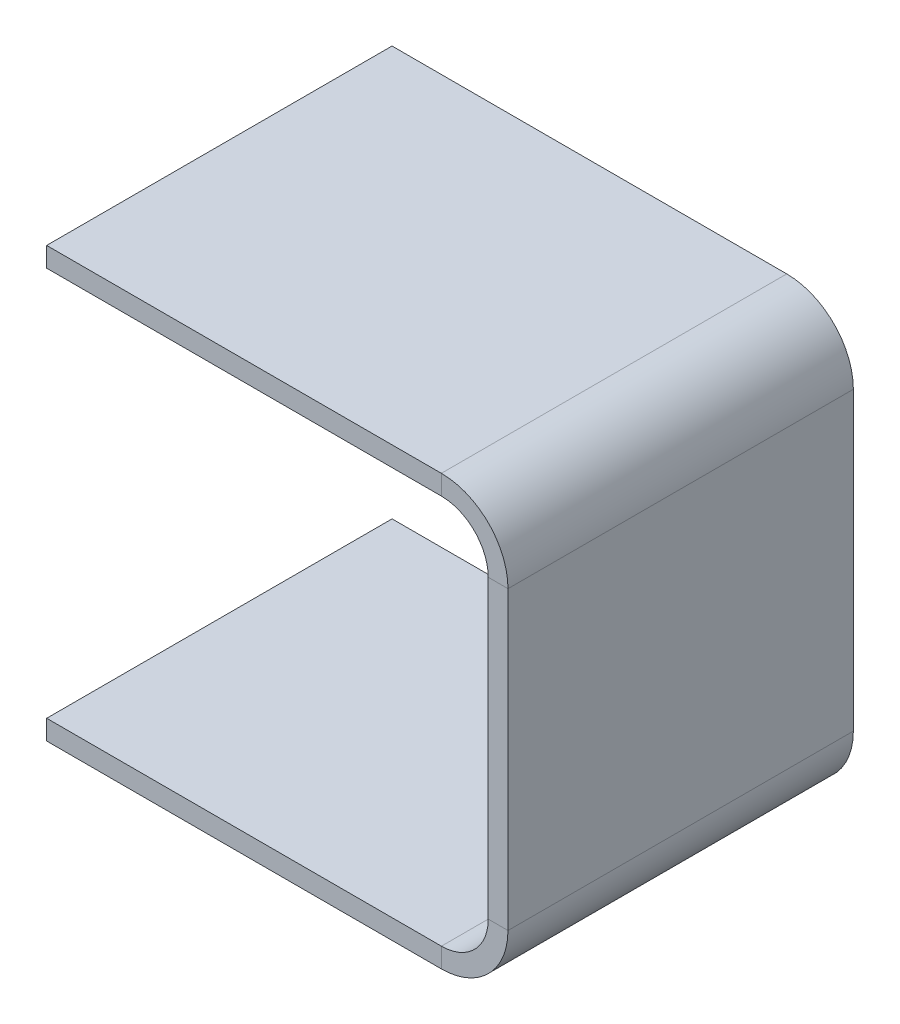
ISO-10303-21;
HEADER;
FILE_DESCRIPTION(('STEP AP214'),'2;1');
FILE_NAME('part.step','',(''),(''),'','','');
FILE_SCHEMA(('AUTOMOTIVE_DESIGN { 1 0 10303 214 1 1 1 1 }'));
ENDSEC;
DATA;
#1=APPLICATION_CONTEXT('core data for automotive mechanical design processes');
#2=APPLICATION_PROTOCOL_DEFINITION('international standard','automotive_design',2000,#1);
#3=PRODUCT_CONTEXT('',#1,'mechanical');
#4=PRODUCT('Part','Part','',(#3));
#5=PRODUCT_RELATED_PRODUCT_CATEGORY('part','',(#4));
#6=PRODUCT_DEFINITION_FORMATION('','',#4);
#7=PRODUCT_DEFINITION_CONTEXT('part definition',#1,'design');
#8=PRODUCT_DEFINITION('design','',#6,#7);
#9=PRODUCT_DEFINITION_SHAPE('','',#8);
#10=(LENGTH_UNIT() NAMED_UNIT(*) SI_UNIT(.MILLI.,.METRE.));
#11=(NAMED_UNIT(*) PLANE_ANGLE_UNIT() SI_UNIT($,.RADIAN.));
#12=(NAMED_UNIT(*) SI_UNIT($,.STERADIAN.) SOLID_ANGLE_UNIT());
#13=UNCERTAINTY_MEASURE_WITH_UNIT(LENGTH_MEASURE(1.E-05),#10,'distance_accuracy_value','');
#14=(GEOMETRIC_REPRESENTATION_CONTEXT(3) GLOBAL_UNCERTAINTY_ASSIGNED_CONTEXT((#13)) GLOBAL_UNIT_ASSIGNED_CONTEXT((#10,
#11,#12)) REPRESENTATION_CONTEXT('',''));
#15=CARTESIAN_POINT('',(0.,0.,0.));
#16=DIRECTION('',(0.,0.,1.));
#17=DIRECTION('',(1.,0.,0.));
#18=AXIS2_PLACEMENT_3D('',#15,#16,#17);
#19=CARTESIAN_POINT('',(39.9958939527827,36.7458939527828,0.));
#20=DIRECTION('',(0.,0.,-1.));
#21=DIRECTION('',(-1.,0.,0.));
#22=AXIS2_PLACEMENT_3D('',#19,#20,#21);
#23=PLANE('',#22);
#24=DIRECTION('',(1.,0.,0.));
#25=VECTOR('',#24,1.);
#26=CARTESIAN_POINT('',(46.7458939527828,36.7458939527828,0.));
#27=LINE('',#26,#25);
#28=CARTESIAN_POINT('',(44.7458939527828,36.7458939527828,0.));
#29=VERTEX_POINT('',#28);
#30=CARTESIAN_POINT('',(46.7458939527828,36.7458939527828,0.));
#31=VERTEX_POINT('',#30);
#32=EDGE_CURVE('E11',#29,#31,#27,.T.);
#33=ORIENTED_EDGE('',*,*,#32,.F.);
#34=CARTESIAN_POINT('',(39.9958939527827,36.7458939527828,0.));
#35=DIRECTION('',(0.,0.,-1.));
#36=DIRECTION('',(-1.,0.,0.));
#37=AXIS2_PLACEMENT_3D('',#34,#35,#36);
#38=CIRCLE('',#37,4.75000000000001);
#39=CARTESIAN_POINT('',(39.9958939527827,41.4958939527828,0.));
#40=VERTEX_POINT('',#39);
#41=EDGE_CURVE('E109',#29,#40,#38,.F.);
#42=ORIENTED_EDGE('',*,*,#41,.T.);
#43=DIRECTION('',(0.,1.,0.));
#44=VECTOR('',#43,1.);
#45=CARTESIAN_POINT('',(39.9958939527827,43.4958939527828,0.));
#46=LINE('',#45,#44);
#47=CARTESIAN_POINT('',(39.9958939527827,43.4958939527828,0.));
#48=VERTEX_POINT('',#47);
#49=EDGE_CURVE('E57',#40,#48,#46,.T.);
#50=ORIENTED_EDGE('',*,*,#49,.T.);
#51=CARTESIAN_POINT('',(39.9958939527827,36.7458939527828,0.));
#52=DIRECTION('',(0.,0.,1.));
#53=DIRECTION('',(1.,0.,0.));
#54=AXIS2_PLACEMENT_3D('',#51,#52,#53);
#55=CIRCLE('',#54,6.75000000000001);
#56=EDGE_CURVE('E112',#31,#48,#55,.T.);
#57=ORIENTED_EDGE('',*,*,#56,.F.);
#58=EDGE_LOOP('',(#33,#42,#50,#57));
#59=FACE_BOUND('',#58,.T.);
#60=ADVANCED_FACE('F46',(#59),#23,.T.);
#61=CARTESIAN_POINT('',(39.9958939527827,43.4958939527828,0.));
#62=DIRECTION('',(0.,0.,1.));
#63=DIRECTION('',(-1.,0.,0.));
#64=AXIS2_PLACEMENT_3D('',#61,#62,#63);
#65=PLANE('',#64);
#66=ORIENTED_EDGE('',*,*,#49,.F.);
#67=DIRECTION('',(1.,0.,0.));
#68=VECTOR('',#67,1.);
#69=CARTESIAN_POINT('',(39.9958939527827,41.4958939527828,0.));
#70=LINE('',#69,#68);
#71=CARTESIAN_POINT('',(-0.0041060472172616,41.4958939527828,0.));
#72=VERTEX_POINT('',#71);
#73=EDGE_CURVE('E302',#40,#72,#70,.F.);
#74=ORIENTED_EDGE('',*,*,#73,.T.);
#75=DIRECTION('',(0.,1.,0.));
#76=VECTOR('',#75,1.);
#77=CARTESIAN_POINT('',(-0.0041060472172616,43.4958939527828,0.));
#78=LINE('',#77,#76);
#79=CARTESIAN_POINT('',(-0.0041060472172616,43.4958939527828,0.));
#80=VERTEX_POINT('',#79);
#81=EDGE_CURVE('E184',#72,#80,#78,.T.);
#82=ORIENTED_EDGE('',*,*,#81,.T.);
#83=DIRECTION('',(-1.,0.,0.));
#84=VECTOR('',#83,1.);
#85=CARTESIAN_POINT('',(39.9958939527827,43.4958939527828,0.));
#86=LINE('',#85,#84);
#87=EDGE_CURVE('E210',#48,#80,#86,.T.);
#88=ORIENTED_EDGE('',*,*,#87,.F.);
#89=EDGE_LOOP('',(#66,#74,#82,#88));
#90=FACE_BOUND('',#89,.T.);
#91=ADVANCED_FACE('F211',(#90),#65,.F.);
#92=CARTESIAN_POINT('',(-0.0041060472172616,43.4958939527828,35.));
#93=DIRECTION('',(-1.,0.,0.));
#94=DIRECTION('',(0.,0.,-1.));
#95=AXIS2_PLACEMENT_3D('',#92,#93,#94);
#96=PLANE('',#95);
#97=ORIENTED_EDGE('',*,*,#81,.F.);
#98=DIRECTION('',(0.,0.,1.));
#99=VECTOR('',#98,1.);
#100=CARTESIAN_POINT('',(-0.0041060472172616,41.4958939527828,35.));
#101=LINE('',#100,#99);
#102=CARTESIAN_POINT('',(-0.0041060472172616,41.4958939527828,35.));
#103=VERTEX_POINT('',#102);
#104=EDGE_CURVE('E299',#103,#72,#101,.F.);
#105=ORIENTED_EDGE('',*,*,#104,.F.);
#106=DIRECTION('',(0.,1.,0.));
#107=VECTOR('',#106,1.);
#108=CARTESIAN_POINT('',(-0.0041060472172616,43.4958939527828,35.));
#109=LINE('',#108,#107);
#110=CARTESIAN_POINT('',(-0.0041060472172616,43.4958939527828,35.));
#111=VERTEX_POINT('',#110);
#112=EDGE_CURVE('E180',#103,#111,#109,.T.);
#113=ORIENTED_EDGE('',*,*,#112,.T.);
#114=DIRECTION('',(0.,0.,-1.));
#115=VECTOR('',#114,1.);
#116=CARTESIAN_POINT('',(-0.0041060472172616,43.4958939527828,35.));
#117=LINE('',#116,#115);
#118=EDGE_CURVE('E216',#111,#80,#117,.T.);
#119=ORIENTED_EDGE('',*,*,#118,.T.);
#120=EDGE_LOOP('',(#97,#105,#113,#119));
#121=FACE_BOUND('',#120,.T.);
#122=ADVANCED_FACE('F311',(#121),#96,.T.);
#123=CARTESIAN_POINT('',(39.9958939527827,43.4958939527828,35.));
#124=DIRECTION('',(0.,0.,1.));
#125=DIRECTION('',(-1.,0.,0.));
#126=AXIS2_PLACEMENT_3D('',#123,#124,#125);
#127=PLANE('',#126);
#128=ORIENTED_EDGE('',*,*,#112,.F.);
#129=DIRECTION('',(1.,0.,0.));
#130=VECTOR('',#129,1.);
#131=CARTESIAN_POINT('',(39.9958939527827,41.4958939527828,35.));
#132=LINE('',#131,#130);
#133=CARTESIAN_POINT('',(39.9958939527827,41.4958939527828,35.));
#134=VERTEX_POINT('',#133);
#135=EDGE_CURVE('E151',#134,#103,#132,.F.);
#136=ORIENTED_EDGE('',*,*,#135,.F.);
#137=DIRECTION('',(0.,1.,0.));
#138=VECTOR('',#137,1.);
#139=CARTESIAN_POINT('',(39.9958939527827,43.4958939527828,35.));
#140=LINE('',#139,#138);
#141=CARTESIAN_POINT('',(39.9958939527827,43.4958939527828,35.));
#142=VERTEX_POINT('',#141);
#143=EDGE_CURVE('E176',#134,#142,#140,.T.);
#144=ORIENTED_EDGE('',*,*,#143,.T.);
#145=DIRECTION('',(-1.,0.,0.));
#146=VECTOR('',#145,1.);
#147=CARTESIAN_POINT('',(39.9958939527827,43.4958939527828,35.));
#148=LINE('',#147,#146);
#149=EDGE_CURVE('E222',#142,#111,#148,.T.);
#150=ORIENTED_EDGE('',*,*,#149,.T.);
#151=EDGE_LOOP('',(#128,#136,#144,#150));
#152=FACE_BOUND('',#151,.T.);
#153=ADVANCED_FACE('F441',(#152),#127,.T.);
#154=CARTESIAN_POINT('',(39.9958939527827,36.7458939527828,35.));
#155=DIRECTION('',(0.,0.,-1.));
#156=DIRECTION('',(-1.,0.,0.));
#157=AXIS2_PLACEMENT_3D('',#154,#155,#156);
#158=PLANE('',#157);
#159=ORIENTED_EDGE('',*,*,#143,.F.);
#160=CARTESIAN_POINT('',(39.9958939527827,36.7458939527828,35.));
#161=DIRECTION('',(0.,0.,-1.));
#162=DIRECTION('',(-1.,0.,0.));
#163=AXIS2_PLACEMENT_3D('',#160,#161,#162);
#164=CIRCLE('',#163,4.75000000000001);
#165=CARTESIAN_POINT('',(44.7458939527828,36.7458939527828,35.));
#166=VERTEX_POINT('',#165);
#167=EDGE_CURVE('E140',#166,#134,#164,.F.);
#168=ORIENTED_EDGE('',*,*,#167,.F.);
#169=DIRECTION('',(1.,0.,0.));
#170=VECTOR('',#169,1.);
#171=CARTESIAN_POINT('',(46.7458939527828,36.7458939527828,35.));
#172=LINE('',#171,#170);
#173=CARTESIAN_POINT('',(46.7458939527828,36.7458939527828,35.));
#174=VERTEX_POINT('',#173);
#175=EDGE_CURVE('E172',#166,#174,#172,.T.);
#176=ORIENTED_EDGE('',*,*,#175,.T.);
#177=CARTESIAN_POINT('',(39.9958939527827,36.7458939527828,35.));
#178=DIRECTION('',(0.,0.,1.));
#179=DIRECTION('',(1.,0.,0.));
#180=AXIS2_PLACEMENT_3D('',#177,#178,#179);
#181=CIRCLE('',#180,6.75000000000001);
#182=EDGE_CURVE('E206',#174,#142,#181,.T.);
#183=ORIENTED_EDGE('',*,*,#182,.T.);
#184=EDGE_LOOP('',(#159,#168,#176,#183));
#185=FACE_BOUND('',#184,.T.);
#186=ADVANCED_FACE('F435',(#185),#158,.F.);
#187=CARTESIAN_POINT('',(46.7458939527828,6.74589395278275,35.));
#188=DIRECTION('',(0.,0.,1.));
#189=DIRECTION('',(0.,1.,0.));
#190=AXIS2_PLACEMENT_3D('',#187,#188,#189);
#191=PLANE('',#190);
#192=ORIENTED_EDGE('',*,*,#175,.F.);
#193=DIRECTION('',(0.,1.,0.));
#194=VECTOR('',#193,1.);
#195=CARTESIAN_POINT('',(44.7458939527828,6.74589395278275,35.));
#196=LINE('',#195,#194);
#197=CARTESIAN_POINT('',(44.7458939527828,6.74589395278275,35.));
#198=VERTEX_POINT('',#197);
#199=EDGE_CURVE('E128',#198,#166,#196,.T.);
#200=ORIENTED_EDGE('',*,*,#199,.F.);
#201=DIRECTION('',(1.,0.,0.));
#202=VECTOR('',#201,1.);
#203=CARTESIAN_POINT('',(46.7458939527828,6.74589395278275,35.));
#204=LINE('',#203,#202);
#205=CARTESIAN_POINT('',(46.7458939527828,6.74589395278275,35.));
#206=VERTEX_POINT('',#205);
#207=EDGE_CURVE('E168',#198,#206,#204,.T.);
#208=ORIENTED_EDGE('',*,*,#207,.T.);
#209=DIRECTION('',(0.,1.,0.));
#210=VECTOR('',#209,1.);
#211=CARTESIAN_POINT('',(46.7458939527828,6.74589395278275,35.));
#212=LINE('',#211,#210);
#213=EDGE_CURVE('E237',#206,#174,#212,.T.);
#214=ORIENTED_EDGE('',*,*,#213,.T.);
#215=EDGE_LOOP('',(#192,#200,#208,#214));
#216=FACE_BOUND('',#215,.T.);
#217=ADVANCED_FACE('F433',(#216),#191,.T.);
#218=CARTESIAN_POINT('',(40.,6.74589395278275,35.));
#219=DIRECTION('',(0.,0.,-1.));
#220=DIRECTION('',(-1.,0.,0.));
#221=AXIS2_PLACEMENT_3D('',#218,#219,#220);
#222=PLANE('',#221);
#223=ORIENTED_EDGE('',*,*,#207,.F.);
#224=CARTESIAN_POINT('',(40.,6.74589395278275,35.));
#225=DIRECTION('',(0.,0.,-1.));
#226=DIRECTION('',(-1.,0.,0.));
#227=AXIS2_PLACEMENT_3D('',#224,#225,#226);
#228=CIRCLE('',#227,4.74589395278275);
#229=CARTESIAN_POINT('',(40.,2.,35.));
#230=VERTEX_POINT('',#229);
#231=EDGE_CURVE('E217',#230,#198,#228,.F.);
#232=ORIENTED_EDGE('',*,*,#231,.F.);
#233=DIRECTION('',(0.,-1.,0.));
#234=VECTOR('',#233,1.);
#235=CARTESIAN_POINT('',(40.,0.,35.));
#236=LINE('',#235,#234);
#237=CARTESIAN_POINT('',(40.,0.,35.));
#238=VERTEX_POINT('',#237);
#239=EDGE_CURVE('E164',#230,#238,#236,.T.);
#240=ORIENTED_EDGE('',*,*,#239,.T.);
#241=CARTESIAN_POINT('',(40.,6.74589395278275,35.));
#242=DIRECTION('',(0.,0.,1.));
#243=DIRECTION('',(1.,0.,0.));
#244=AXIS2_PLACEMENT_3D('',#241,#242,#243);
#245=CIRCLE('',#244,6.74589395278275);
#246=EDGE_CURVE('E265',#238,#206,#245,.T.);
#247=ORIENTED_EDGE('',*,*,#246,.T.);
#248=EDGE_LOOP('',(#223,#232,#240,#247));
#249=FACE_BOUND('',#248,.T.);
#250=ADVANCED_FACE('F416',(#249),#222,.F.);
#251=CARTESIAN_POINT('',(0.,0.,35.));
#252=DIRECTION('',(0.,0.,1.));
#253=DIRECTION('',(1.,0.,0.));
#254=AXIS2_PLACEMENT_3D('',#251,#252,#253);
#255=PLANE('',#254);
#256=ORIENTED_EDGE('',*,*,#239,.F.);
#257=DIRECTION('',(1.,0.,0.));
#258=VECTOR('',#257,1.);
#259=CARTESIAN_POINT('',(0.,2.,35.));
#260=LINE('',#259,#258);
#261=CARTESIAN_POINT('',(0.,2.,35.));
#262=VERTEX_POINT('',#261);
#263=EDGE_CURVE('E274',#262,#230,#260,.T.);
#264=ORIENTED_EDGE('',*,*,#263,.F.);
#265=DIRECTION('',(0.,-1.,0.));
#266=VECTOR('',#265,1.);
#267=CARTESIAN_POINT('',(0.,0.,35.));
#268=LINE('',#267,#266);
#269=CARTESIAN_POINT('',(0.,0.,35.));
#270=VERTEX_POINT('',#269);
#271=EDGE_CURVE('E161',#262,#270,#268,.T.);
#272=ORIENTED_EDGE('',*,*,#271,.T.);
#273=DIRECTION('',(1.,0.,0.));
#274=VECTOR('',#273,1.);
#275=CARTESIAN_POINT('',(0.,0.,35.));
#276=LINE('',#275,#274);
#277=EDGE_CURVE('E254',#270,#238,#276,.T.);
#278=ORIENTED_EDGE('',*,*,#277,.T.);
#279=EDGE_LOOP('',(#256,#264,#272,#278));
#280=FACE_BOUND('',#279,.T.);
#281=ADVANCED_FACE('F488',(#280),#255,.T.);
#282=CARTESIAN_POINT('',(0.,0.,35.));
#283=DIRECTION('',(1.,0.,0.));
#284=DIRECTION('',(0.,0.,-1.));
#285=AXIS2_PLACEMENT_3D('',#282,#283,#284);
#286=PLANE('',#285);
#287=ORIENTED_EDGE('',*,*,#271,.F.);
#288=DIRECTION('',(0.,0.,1.));
#289=VECTOR('',#288,1.);
#290=CARTESIAN_POINT('',(0.,2.,35.));
#291=LINE('',#290,#289);
#292=CARTESIAN_POINT('',(0.,2.,0.));
#293=VERTEX_POINT('',#292);
#294=EDGE_CURVE('E280',#262,#293,#291,.F.);
#295=ORIENTED_EDGE('',*,*,#294,.T.);
#296=DIRECTION('',(0.,-1.,0.));
#297=VECTOR('',#296,1.);
#298=CARTESIAN_POINT('',(0.,0.,0.));
#299=LINE('',#298,#297);
#300=CARTESIAN_POINT('',(0.,0.,0.));
#301=VERTEX_POINT('',#300);
#302=EDGE_CURVE('E65',#293,#301,#299,.T.);
#303=ORIENTED_EDGE('',*,*,#302,.T.);
#304=DIRECTION('',(0.,0.,-1.));
#305=VECTOR('',#304,1.);
#306=CARTESIAN_POINT('',(0.,0.,35.));
#307=LINE('',#306,#305);
#308=EDGE_CURVE('E258',#270,#301,#307,.T.);
#309=ORIENTED_EDGE('',*,*,#308,.F.);
#310=EDGE_LOOP('',(#287,#295,#303,#309));
#311=FACE_BOUND('',#310,.T.);
#312=ADVANCED_FACE('F497',(#311),#286,.F.);
#313=CARTESIAN_POINT('',(0.,0.,0.));
#314=DIRECTION('',(0.,0.,1.));
#315=DIRECTION('',(1.,0.,0.));
#316=AXIS2_PLACEMENT_3D('',#313,#314,#315);
#317=PLANE('',#316);
#318=ORIENTED_EDGE('',*,*,#302,.F.);
#319=DIRECTION('',(1.,0.,0.));
#320=VECTOR('',#319,1.);
#321=CARTESIAN_POINT('',(0.,2.,0.));
#322=LINE('',#321,#320);
#323=CARTESIAN_POINT('',(40.,2.,0.));
#324=VERTEX_POINT('',#323);
#325=EDGE_CURVE('E275',#293,#324,#322,.T.);
#326=ORIENTED_EDGE('',*,*,#325,.T.);
#327=DIRECTION('',(0.,-1.,0.));
#328=VECTOR('',#327,1.);
#329=CARTESIAN_POINT('',(40.,0.,0.));
#330=LINE('',#329,#328);
#331=CARTESIAN_POINT('',(40.,0.,0.));
#332=VERTEX_POINT('',#331);
#333=EDGE_CURVE('E155',#324,#332,#330,.T.);
#334=ORIENTED_EDGE('',*,*,#333,.T.);
#335=DIRECTION('',(1.,0.,0.));
#336=VECTOR('',#335,1.);
#337=CARTESIAN_POINT('',(0.,0.,0.));
#338=LINE('',#337,#336);
#339=EDGE_CURVE('E246',#301,#332,#338,.T.);
#340=ORIENTED_EDGE('',*,*,#339,.F.);
#341=EDGE_LOOP('',(#318,#326,#334,#340));
#342=FACE_BOUND('',#341,.T.);
#343=ADVANCED_FACE('F424',(#342),#317,.F.);
#344=CARTESIAN_POINT('',(40.,6.74589395278275,0.));
#345=DIRECTION('',(0.,0.,-1.));
#346=DIRECTION('',(-1.,0.,0.));
#347=AXIS2_PLACEMENT_3D('',#344,#345,#346);
#348=PLANE('',#347);
#349=ORIENTED_EDGE('',*,*,#333,.F.);
#350=CARTESIAN_POINT('',(40.,6.74589395278275,0.));
#351=DIRECTION('',(0.,0.,-1.));
#352=DIRECTION('',(-1.,0.,0.));
#353=AXIS2_PLACEMENT_3D('',#350,#351,#352);
#354=CIRCLE('',#353,4.74589395278275);
#355=CARTESIAN_POINT('',(44.7458939527828,6.74589395278276,0.));
#356=VERTEX_POINT('',#355);
#357=EDGE_CURVE('E277',#324,#356,#354,.F.);
#358=ORIENTED_EDGE('',*,*,#357,.T.);
#359=DIRECTION('',(1.,0.,0.));
#360=VECTOR('',#359,1.);
#361=CARTESIAN_POINT('',(46.7458939527828,6.74589395278275,0.));
#362=LINE('',#361,#360);
#363=CARTESIAN_POINT('',(46.7458939527828,6.74589395278275,0.));
#364=VERTEX_POINT('',#363);
#365=EDGE_CURVE('E50',#356,#364,#362,.T.);
#366=ORIENTED_EDGE('',*,*,#365,.T.);
#367=CARTESIAN_POINT('',(40.,6.74589395278275,0.));
#368=DIRECTION('',(0.,0.,1.));
#369=DIRECTION('',(1.,0.,0.));
#370=AXIS2_PLACEMENT_3D('',#367,#368,#369);
#371=CIRCLE('',#370,6.74589395278275);
#372=EDGE_CURVE('E261',#332,#364,#371,.T.);
#373=ORIENTED_EDGE('',*,*,#372,.F.);
#374=EDGE_LOOP('',(#349,#358,#366,#373));
#375=FACE_BOUND('',#374,.T.);
#376=ADVANCED_FACE('F399',(#375),#348,.T.);
#377=CARTESIAN_POINT('',(46.7458939527828,6.74589395278275,0.));
#378=DIRECTION('',(0.,0.,1.));
#379=DIRECTION('',(0.,1.,0.));
#380=AXIS2_PLACEMENT_3D('',#377,#378,#379);
#381=PLANE('',#380);
#382=DIRECTION('',(0.,1.,0.));
#383=VECTOR('',#382,1.);
#384=CARTESIAN_POINT('',(44.7458939527828,6.74589395278275,0.));
#385=LINE('',#384,#383);
#386=EDGE_CURVE('E125',#356,#29,#385,.T.);
#387=ORIENTED_EDGE('',*,*,#386,.T.);
#388=ORIENTED_EDGE('',*,*,#32,.T.);
#389=DIRECTION('',(0.,1.,0.));
#390=VECTOR('',#389,1.);
#391=CARTESIAN_POINT('',(46.7458939527828,6.74589395278275,0.));
#392=LINE('',#391,#390);
#393=EDGE_CURVE('E225',#364,#31,#392,.T.);
#394=ORIENTED_EDGE('',*,*,#393,.F.);
#395=ORIENTED_EDGE('',*,*,#365,.F.);
#396=EDGE_LOOP('',(#387,#388,#394,#395));
#397=FACE_BOUND('',#396,.T.);
#398=ADVANCED_FACE('F48',(#397),#381,.F.);
#399=CARTESIAN_POINT('',(40.,6.74589395278275,35.));
#400=DIRECTION('',(0.,0.,-1.));
#401=DIRECTION('',(-1.,0.,0.));
#402=AXIS2_PLACEMENT_3D('',#399,#400,#401);
#403=CYLINDRICAL_SURFACE('',#402,6.74589395278275);
#404=ORIENTED_EDGE('',*,*,#372,.T.);
#405=DIRECTION('',(0.,0.,-1.));
#406=VECTOR('',#405,1.);
#407=CARTESIAN_POINT('',(46.7458939527828,6.74589395278275,35.));
#408=LINE('',#407,#406);
#409=EDGE_CURVE('E207',#206,#364,#408,.T.);
#410=ORIENTED_EDGE('',*,*,#409,.F.);
#411=ORIENTED_EDGE('',*,*,#246,.F.);
#412=DIRECTION('',(0.,0.,-1.));
#413=VECTOR('',#412,1.);
#414=CARTESIAN_POINT('',(40.,0.,35.));
#415=LINE('',#414,#413);
#416=EDGE_CURVE('E250',#238,#332,#415,.T.);
#417=ORIENTED_EDGE('',*,*,#416,.T.);
#418=EDGE_LOOP('',(#404,#410,#411,#417));
#419=FACE_BOUND('',#418,.T.);
#420=ADVANCED_FACE('F406',(#419),#403,.T.);
#421=CARTESIAN_POINT('',(0.,0.,35.));
#422=DIRECTION('',(0.,1.,0.));
#423=DIRECTION('',(0.,0.,1.));
#424=AXIS2_PLACEMENT_3D('',#421,#422,#423);
#425=PLANE('',#424);
#426=ORIENTED_EDGE('',*,*,#339,.T.);
#427=ORIENTED_EDGE('',*,*,#416,.F.);
#428=ORIENTED_EDGE('',*,*,#277,.F.);
#429=ORIENTED_EDGE('',*,*,#308,.T.);
#430=EDGE_LOOP('',(#426,#427,#428,#429));
#431=FACE_BOUND('',#430,.T.);
#432=ADVANCED_FACE('F420',(#431),#425,.F.);
#433=CARTESIAN_POINT('',(39.9958939527827,36.7458939527828,35.));
#434=DIRECTION('',(0.,0.,-1.));
#435=DIRECTION('',(-1.,0.,0.));
#436=AXIS2_PLACEMENT_3D('',#433,#434,#435);
#437=CYLINDRICAL_SURFACE('',#436,6.75000000000001);
#438=ORIENTED_EDGE('',*,*,#56,.T.);
#439=DIRECTION('',(0.,0.,-1.));
#440=VECTOR('',#439,1.);
#441=CARTESIAN_POINT('',(39.9958939527827,43.4958939527828,35.));
#442=LINE('',#441,#440);
#443=EDGE_CURVE('E202',#142,#48,#442,.T.);
#444=ORIENTED_EDGE('',*,*,#443,.F.);
#445=ORIENTED_EDGE('',*,*,#182,.F.);
#446=DIRECTION('',(0.,0.,-1.));
#447=VECTOR('',#446,1.);
#448=CARTESIAN_POINT('',(46.7458939527828,36.7458939527828,35.));
#449=LINE('',#448,#447);
#450=EDGE_CURVE('E204',#174,#31,#449,.T.);
#451=ORIENTED_EDGE('',*,*,#450,.T.);
#452=EDGE_LOOP('',(#438,#444,#445,#451));
#453=FACE_BOUND('',#452,.T.);
#454=ADVANCED_FACE('F199',(#453),#437,.T.);
#455=CARTESIAN_POINT('',(46.7458939527828,6.74589395278275,35.));
#456=DIRECTION('',(-1.,0.,0.));
#457=DIRECTION('',(0.,0.,1.));
#458=AXIS2_PLACEMENT_3D('',#455,#456,#457);
#459=PLANE('',#458);
#460=ORIENTED_EDGE('',*,*,#393,.T.);
#461=ORIENTED_EDGE('',*,*,#450,.F.);
#462=ORIENTED_EDGE('',*,*,#213,.F.);
#463=ORIENTED_EDGE('',*,*,#409,.T.);
#464=EDGE_LOOP('',(#460,#461,#462,#463));
#465=FACE_BOUND('',#464,.T.);
#466=ADVANCED_FACE('F411',(#465),#459,.F.);
#467=CARTESIAN_POINT('',(39.9958939527827,43.4958939527828,35.));
#468=DIRECTION('',(0.,-1.,0.));
#469=DIRECTION('',(1.,0.,0.));
#470=AXIS2_PLACEMENT_3D('',#467,#468,#469);
#471=PLANE('',#470);
#472=ORIENTED_EDGE('',*,*,#87,.T.);
#473=ORIENTED_EDGE('',*,*,#118,.F.);
#474=ORIENTED_EDGE('',*,*,#149,.F.);
#475=ORIENTED_EDGE('',*,*,#443,.T.);
#476=EDGE_LOOP('',(#472,#473,#474,#475));
#477=FACE_BOUND('',#476,.T.);
#478=ADVANCED_FACE('F220',(#477),#471,.F.);
#479=CARTESIAN_POINT('',(40.,6.74589395278275,35.));
#480=DIRECTION('',(0.,0.,-1.));
#481=DIRECTION('',(-1.,0.,0.));
#482=AXIS2_PLACEMENT_3D('',#479,#480,#481);
#483=CYLINDRICAL_SURFACE('',#482,4.74589395278275);
#484=ORIENTED_EDGE('',*,*,#357,.F.);
#485=DIRECTION('',(0.,0.,-1.));
#486=VECTOR('',#485,1.);
#487=CARTESIAN_POINT('',(40.,2.,35.));
#488=LINE('',#487,#486);
#489=EDGE_CURVE('E271',#230,#324,#488,.T.);
#490=ORIENTED_EDGE('',*,*,#489,.F.);
#491=ORIENTED_EDGE('',*,*,#231,.T.);
#492=DIRECTION('',(0.,0.,1.));
#493=VECTOR('',#492,1.);
#494=CARTESIAN_POINT('',(44.7458939527828,6.74589395278275,35.));
#495=LINE('',#494,#493);
#496=EDGE_CURVE('E141',#198,#356,#495,.F.);
#497=ORIENTED_EDGE('',*,*,#496,.T.);
#498=EDGE_LOOP('',(#484,#490,#491,#497));
#499=FACE_BOUND('',#498,.T.);
#500=ADVANCED_FACE('F432',(#499),#483,.F.);
#501=CARTESIAN_POINT('',(0.,2.,35.));
#502=DIRECTION('',(0.,1.,0.));
#503=DIRECTION('',(0.,0.,1.));
#504=AXIS2_PLACEMENT_3D('',#501,#502,#503);
#505=PLANE('',#504);
#506=ORIENTED_EDGE('',*,*,#325,.F.);
#507=ORIENTED_EDGE('',*,*,#294,.F.);
#508=ORIENTED_EDGE('',*,*,#263,.T.);
#509=ORIENTED_EDGE('',*,*,#489,.T.);
#510=EDGE_LOOP('',(#506,#507,#508,#509));
#511=FACE_BOUND('',#510,.T.);
#512=ADVANCED_FACE('F428',(#511),#505,.T.);
#513=CARTESIAN_POINT('',(39.9958939527827,36.7458939527828,35.));
#514=DIRECTION('',(0.,0.,-1.));
#515=DIRECTION('',(-1.,0.,0.));
#516=AXIS2_PLACEMENT_3D('',#513,#514,#515);
#517=CYLINDRICAL_SURFACE('',#516,4.75000000000001);
#518=ORIENTED_EDGE('',*,*,#41,.F.);
#519=DIRECTION('',(0.,0.,-1.));
#520=VECTOR('',#519,1.);
#521=CARTESIAN_POINT('',(44.7458939527828,36.7458939527828,35.));
#522=LINE('',#521,#520);
#523=EDGE_CURVE('E122',#166,#29,#522,.T.);
#524=ORIENTED_EDGE('',*,*,#523,.F.);
#525=ORIENTED_EDGE('',*,*,#167,.T.);
#526=DIRECTION('',(0.,0.,1.));
#527=VECTOR('',#526,1.);
#528=CARTESIAN_POINT('',(39.9958939527827,41.4958939527828,35.));
#529=LINE('',#528,#527);
#530=EDGE_CURVE('E137',#134,#40,#529,.F.);
#531=ORIENTED_EDGE('',*,*,#530,.T.);
#532=EDGE_LOOP('',(#518,#524,#525,#531));
#533=FACE_BOUND('',#532,.T.);
#534=ADVANCED_FACE('F135',(#533),#517,.F.);
#535=CARTESIAN_POINT('',(44.7458939527828,6.74589395278275,35.));
#536=DIRECTION('',(-1.,0.,0.));
#537=DIRECTION('',(0.,0.,1.));
#538=AXIS2_PLACEMENT_3D('',#535,#536,#537);
#539=PLANE('',#538);
#540=ORIENTED_EDGE('',*,*,#386,.F.);
#541=ORIENTED_EDGE('',*,*,#496,.F.);
#542=ORIENTED_EDGE('',*,*,#199,.T.);
#543=ORIENTED_EDGE('',*,*,#523,.T.);
#544=EDGE_LOOP('',(#540,#541,#542,#543));
#545=FACE_BOUND('',#544,.T.);
#546=ADVANCED_FACE('F123',(#545),#539,.T.);
#547=CARTESIAN_POINT('',(39.9958939527827,41.4958939527828,35.));
#548=DIRECTION('',(0.,-1.,0.));
#549=DIRECTION('',(1.,0.,0.));
#550=AXIS2_PLACEMENT_3D('',#547,#548,#549);
#551=PLANE('',#550);
#552=ORIENTED_EDGE('',*,*,#73,.F.);
#553=ORIENTED_EDGE('',*,*,#530,.F.);
#554=ORIENTED_EDGE('',*,*,#135,.T.);
#555=ORIENTED_EDGE('',*,*,#104,.T.);
#556=EDGE_LOOP('',(#552,#553,#554,#555));
#557=FACE_BOUND('',#556,.T.);
#558=ADVANCED_FACE('F307',(#557),#551,.T.);
#559=CLOSED_SHELL('',(#60,#91,#122,#153,#186,#217,#250,#281,#312,#343,#376,#398,#420,#432,#454,
#466,#478,#500,#512,#534,#546,#558));
#560=MANIFOLD_SOLID_BREP('B2',#559);
#561=ADVANCED_BREP_SHAPE_REPRESENTATION('',(#18,#560),#14);
#562=SHAPE_DEFINITION_REPRESENTATION(#9,#561);
ENDSEC;
END-ISO-10303-21;
